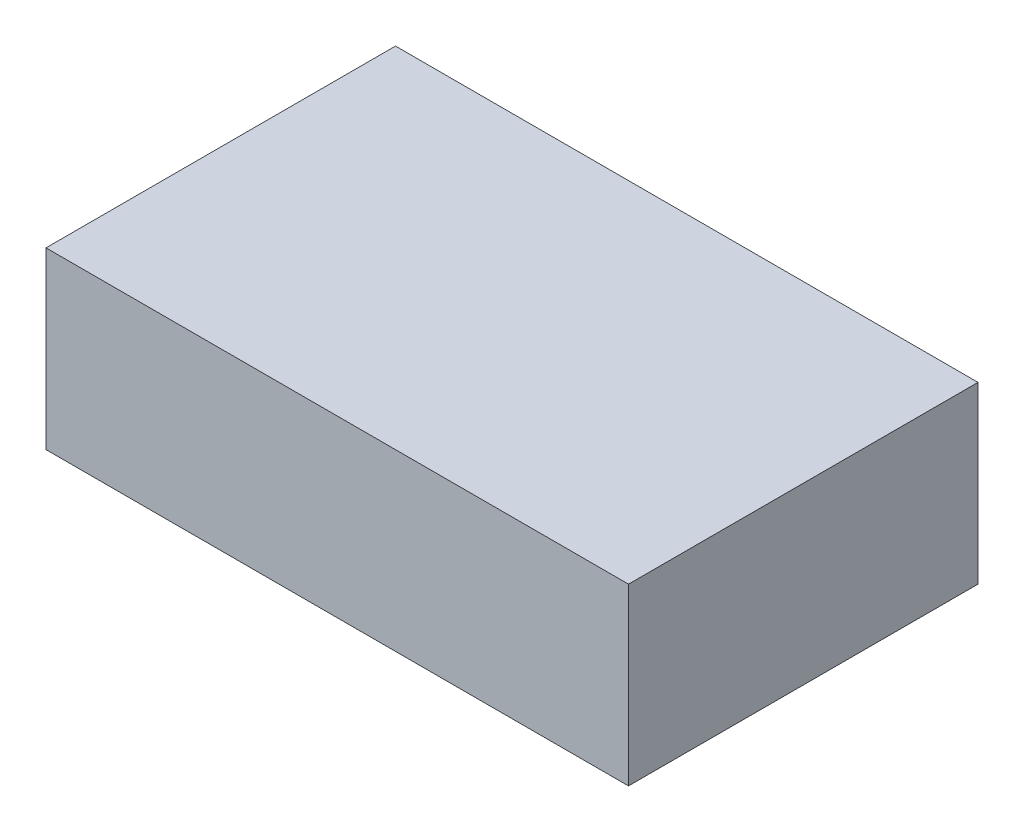
ISO-10303-21;
HEADER;
FILE_DESCRIPTION(('STEP AP214'),'2;1');
FILE_NAME('part.step','',(''),(''),'','','');
FILE_SCHEMA(('AUTOMOTIVE_DESIGN { 1 0 10303 214 1 1 1 1 }'));
ENDSEC;
DATA;
#1=APPLICATION_CONTEXT('core data for automotive mechanical design processes');
#2=APPLICATION_PROTOCOL_DEFINITION('international standard','automotive_design',2000,#1);
#3=PRODUCT_CONTEXT('',#1,'mechanical');
#4=PRODUCT('Part','Part','',(#3));
#5=PRODUCT_RELATED_PRODUCT_CATEGORY('part','',(#4));
#6=PRODUCT_DEFINITION_FORMATION('','',#4);
#7=PRODUCT_DEFINITION_CONTEXT('part definition',#1,'design');
#8=PRODUCT_DEFINITION('design','',#6,#7);
#9=PRODUCT_DEFINITION_SHAPE('','',#8);
#10=(LENGTH_UNIT() NAMED_UNIT(*) SI_UNIT(.MILLI.,.METRE.));
#11=(NAMED_UNIT(*) PLANE_ANGLE_UNIT() SI_UNIT($,.RADIAN.));
#12=(NAMED_UNIT(*) SI_UNIT($,.STERADIAN.) SOLID_ANGLE_UNIT());
#13=UNCERTAINTY_MEASURE_WITH_UNIT(LENGTH_MEASURE(1.E-05),#10,'distance_accuracy_value','');
#14=(GEOMETRIC_REPRESENTATION_CONTEXT(3) GLOBAL_UNCERTAINTY_ASSIGNED_CONTEXT((#13)) GLOBAL_UNIT_ASSIGNED_CONTEXT((#10,
#11,#12)) REPRESENTATION_CONTEXT('',''));
#15=CARTESIAN_POINT('',(0.,0.,0.));
#16=DIRECTION('',(0.,0.,1.));
#17=DIRECTION('',(1.,0.,0.));
#18=AXIS2_PLACEMENT_3D('',#15,#16,#17);
#19=CARTESIAN_POINT('',(-50.,30.,-30.));
#20=DIRECTION('',(1.,0.,0.));
#21=DIRECTION('',(0.,0.,-1.));
#22=AXIS2_PLACEMENT_3D('',#19,#20,#21);
#23=PLANE('',#22);
#24=DIRECTION('',(0.,0.,1.));
#25=VECTOR('',#24,1.);
#26=CARTESIAN_POINT('',(-50.,0.,-30.));
#27=LINE('',#26,#25);
#28=CARTESIAN_POINT('',(-50.,0.,-30.));
#29=VERTEX_POINT('',#28);
#30=CARTESIAN_POINT('',(-50.,0.,30.));
#31=VERTEX_POINT('',#30);
#32=EDGE_CURVE('E96',#29,#31,#27,.T.);
#33=ORIENTED_EDGE('',*,*,#32,.T.);
#34=DIRECTION('',(0.,-1.,0.));
#35=VECTOR('',#34,1.);
#36=CARTESIAN_POINT('',(-50.,30.,30.));
#37=LINE('',#36,#35);
#38=CARTESIAN_POINT('',(-50.,30.,30.));
#39=VERTEX_POINT('',#38);
#40=EDGE_CURVE('E11',#39,#31,#37,.T.);
#41=ORIENTED_EDGE('',*,*,#40,.F.);
#42=DIRECTION('',(0.,0.,1.));
#43=VECTOR('',#42,1.);
#44=CARTESIAN_POINT('',(-50.,30.,-30.));
#45=LINE('',#44,#43);
#46=CARTESIAN_POINT('',(-50.,30.,-30.));
#47=VERTEX_POINT('',#46);
#48=EDGE_CURVE('E84',#47,#39,#45,.T.);
#49=ORIENTED_EDGE('',*,*,#48,.F.);
#50=DIRECTION('',(0.,-1.,0.));
#51=VECTOR('',#50,1.);
#52=CARTESIAN_POINT('',(-50.,30.,-30.));
#53=LINE('',#52,#51);
#54=EDGE_CURVE('E92',#47,#29,#53,.T.);
#55=ORIENTED_EDGE('',*,*,#54,.T.);
#56=EDGE_LOOP('',(#33,#41,#49,#55));
#57=FACE_BOUND('',#56,.T.);
#58=ADVANCED_FACE('F33',(#57),#23,.F.);
#59=CARTESIAN_POINT('',(-50.,30.,30.));
#60=DIRECTION('',(0.,0.,-1.));
#61=DIRECTION('',(-1.,0.,0.));
#62=AXIS2_PLACEMENT_3D('',#59,#60,#61);
#63=PLANE('',#62);
#64=DIRECTION('',(1.,0.,0.));
#65=VECTOR('',#64,1.);
#66=CARTESIAN_POINT('',(-50.,0.,30.));
#67=LINE('',#66,#65);
#68=CARTESIAN_POINT('',(50.,0.,30.));
#69=VERTEX_POINT('',#68);
#70=EDGE_CURVE('E88',#31,#69,#67,.T.);
#71=ORIENTED_EDGE('',*,*,#70,.T.);
#72=DIRECTION('',(0.,-1.,0.));
#73=VECTOR('',#72,1.);
#74=CARTESIAN_POINT('',(50.,30.,30.));
#75=LINE('',#74,#73);
#76=CARTESIAN_POINT('',(50.,30.,30.));
#77=VERTEX_POINT('',#76);
#78=EDGE_CURVE('E41',#77,#69,#75,.T.);
#79=ORIENTED_EDGE('',*,*,#78,.F.);
#80=DIRECTION('',(1.,0.,0.));
#81=VECTOR('',#80,1.);
#82=CARTESIAN_POINT('',(-50.,30.,30.));
#83=LINE('',#82,#81);
#84=EDGE_CURVE('E79',#39,#77,#83,.T.);
#85=ORIENTED_EDGE('',*,*,#84,.F.);
#86=ORIENTED_EDGE('',*,*,#40,.T.);
#87=EDGE_LOOP('',(#71,#79,#85,#86));
#88=FACE_BOUND('',#87,.T.);
#89=ADVANCED_FACE('F87',(#88),#63,.F.);
#90=CARTESIAN_POINT('',(50.,30.,-30.));
#91=DIRECTION('',(-1.,0.,0.));
#92=DIRECTION('',(0.,0.,1.));
#93=AXIS2_PLACEMENT_3D('',#90,#91,#92);
#94=PLANE('',#93);
#95=DIRECTION('',(0.,0.,-1.));
#96=VECTOR('',#95,1.);
#97=CARTESIAN_POINT('',(50.,0.,-30.));
#98=LINE('',#97,#96);
#99=CARTESIAN_POINT('',(50.,0.,-30.));
#100=VERTEX_POINT('',#99);
#101=EDGE_CURVE('E66',#69,#100,#98,.T.);
#102=ORIENTED_EDGE('',*,*,#101,.T.);
#103=DIRECTION('',(0.,-1.,0.));
#104=VECTOR('',#103,1.);
#105=CARTESIAN_POINT('',(50.,30.,-30.));
#106=LINE('',#105,#104);
#107=CARTESIAN_POINT('',(50.,30.,-30.));
#108=VERTEX_POINT('',#107);
#109=EDGE_CURVE('E89',#108,#100,#106,.T.);
#110=ORIENTED_EDGE('',*,*,#109,.F.);
#111=DIRECTION('',(0.,0.,-1.));
#112=VECTOR('',#111,1.);
#113=CARTESIAN_POINT('',(50.,30.,-30.));
#114=LINE('',#113,#112);
#115=EDGE_CURVE('E82',#77,#108,#114,.T.);
#116=ORIENTED_EDGE('',*,*,#115,.F.);
#117=ORIENTED_EDGE('',*,*,#78,.T.);
#118=EDGE_LOOP('',(#102,#110,#116,#117));
#119=FACE_BOUND('',#118,.T.);
#120=ADVANCED_FACE('F90',(#119),#94,.F.);
#121=CARTESIAN_POINT('',(-50.,30.,-30.));
#122=DIRECTION('',(0.,0.,1.));
#123=DIRECTION('',(1.,0.,0.));
#124=AXIS2_PLACEMENT_3D('',#121,#122,#123);
#125=PLANE('',#124);
#126=DIRECTION('',(-1.,0.,0.));
#127=VECTOR('',#126,1.);
#128=CARTESIAN_POINT('',(-50.,0.,-30.));
#129=LINE('',#128,#127);
#130=EDGE_CURVE('E72',#100,#29,#129,.T.);
#131=ORIENTED_EDGE('',*,*,#130,.T.);
#132=ORIENTED_EDGE('',*,*,#54,.F.);
#133=DIRECTION('',(-1.,0.,0.));
#134=VECTOR('',#133,1.);
#135=CARTESIAN_POINT('',(-50.,30.,-30.));
#136=LINE('',#135,#134);
#137=EDGE_CURVE('E49',#108,#47,#136,.T.);
#138=ORIENTED_EDGE('',*,*,#137,.F.);
#139=ORIENTED_EDGE('',*,*,#109,.T.);
#140=EDGE_LOOP('',(#131,#132,#138,#139));
#141=FACE_BOUND('',#140,.T.);
#142=ADVANCED_FACE('F103',(#141),#125,.F.);
#143=CARTESIAN_POINT('',(0.,30.,0.));
#144=DIRECTION('',(0.,1.,0.));
#145=DIRECTION('',(0.,0.,1.));
#146=AXIS2_PLACEMENT_3D('',#143,#144,#145);
#147=PLANE('',#146);
#148=ORIENTED_EDGE('',*,*,#48,.T.);
#149=ORIENTED_EDGE('',*,*,#84,.T.);
#150=ORIENTED_EDGE('',*,*,#115,.T.);
#151=ORIENTED_EDGE('',*,*,#137,.T.);
#152=EDGE_LOOP('',(#148,#149,#150,#151));
#153=FACE_BOUND('',#152,.T.);
#154=ADVANCED_FACE('F80',(#153),#147,.T.);
#155=CARTESIAN_POINT('',(0.,0.,0.));
#156=DIRECTION('',(0.,1.,0.));
#157=DIRECTION('',(0.,0.,1.));
#158=AXIS2_PLACEMENT_3D('',#155,#156,#157);
#159=PLANE('',#158);
#160=ORIENTED_EDGE('',*,*,#32,.F.);
#161=ORIENTED_EDGE('',*,*,#130,.F.);
#162=ORIENTED_EDGE('',*,*,#101,.F.);
#163=ORIENTED_EDGE('',*,*,#70,.F.);
#164=EDGE_LOOP('',(#160,#161,#162,#163));
#165=FACE_BOUND('',#164,.T.);
#166=ADVANCED_FACE('F106',(#165),#159,.F.);
#167=CLOSED_SHELL('',(#58,#89,#120,#142,#154,#166));
#168=MANIFOLD_SOLID_BREP('B2',#167);
#169=ADVANCED_BREP_SHAPE_REPRESENTATION('',(#18,#168),#14);
#170=SHAPE_DEFINITION_REPRESENTATION(#9,#169);
ENDSEC;
END-ISO-10303-21;
